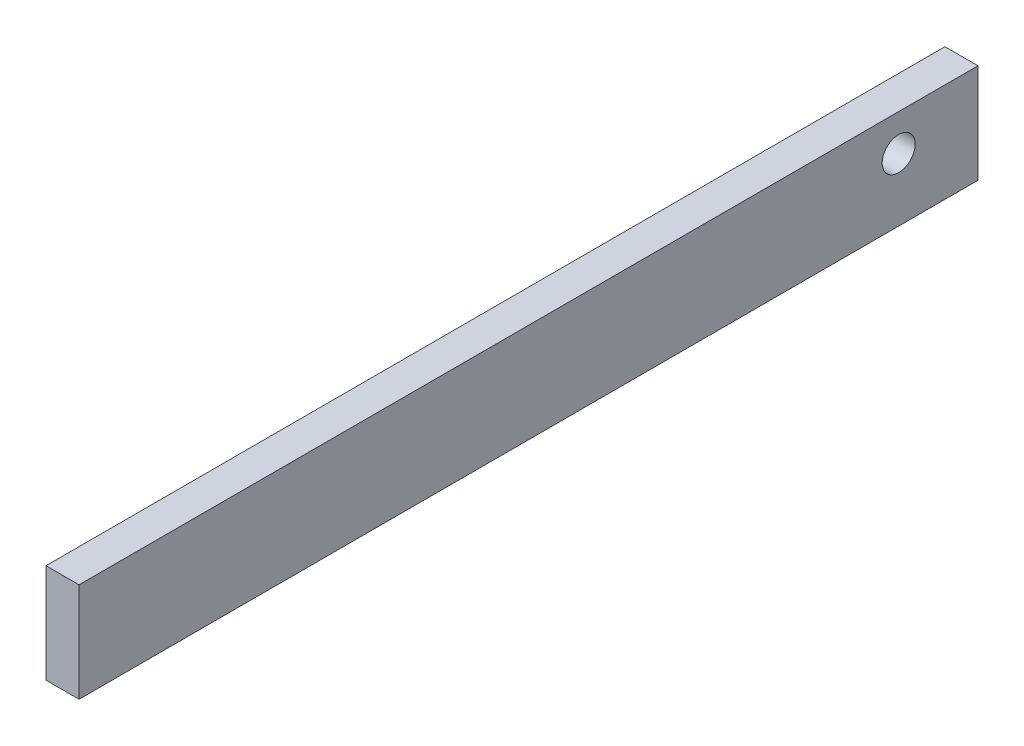
ISO-10303-21;
HEADER;
FILE_DESCRIPTION(('STEP AP214'),'2;1');
FILE_NAME('part.step','',(''),(''),'','','');
FILE_SCHEMA(('AUTOMOTIVE_DESIGN { 1 0 10303 214 1 1 1 1 }'));
ENDSEC;
DATA;
#1=APPLICATION_CONTEXT('core data for automotive mechanical design processes');
#2=APPLICATION_PROTOCOL_DEFINITION('international standard','automotive_design',2000,#1);
#3=PRODUCT_CONTEXT('',#1,'mechanical');
#4=PRODUCT('Part','Part','',(#3));
#5=PRODUCT_RELATED_PRODUCT_CATEGORY('part','',(#4));
#6=PRODUCT_DEFINITION_FORMATION('','',#4);
#7=PRODUCT_DEFINITION_CONTEXT('part definition',#1,'design');
#8=PRODUCT_DEFINITION('design','',#6,#7);
#9=PRODUCT_DEFINITION_SHAPE('','',#8);
#10=(LENGTH_UNIT() NAMED_UNIT(*) SI_UNIT(.MILLI.,.METRE.));
#11=(NAMED_UNIT(*) PLANE_ANGLE_UNIT() SI_UNIT($,.RADIAN.));
#12=(NAMED_UNIT(*) SI_UNIT($,.STERADIAN.) SOLID_ANGLE_UNIT());
#13=UNCERTAINTY_MEASURE_WITH_UNIT(LENGTH_MEASURE(1.E-05),#10,'distance_accuracy_value','');
#14=(GEOMETRIC_REPRESENTATION_CONTEXT(3) GLOBAL_UNCERTAINTY_ASSIGNED_CONTEXT((#13)) GLOBAL_UNIT_ASSIGNED_CONTEXT((#10,
#11,#12)) REPRESENTATION_CONTEXT('',''));
#15=CARTESIAN_POINT('',(0.,0.,0.));
#16=DIRECTION('',(0.,0.,1.));
#17=DIRECTION('',(1.,0.,0.));
#18=AXIS2_PLACEMENT_3D('',#15,#16,#17);
#19=CARTESIAN_POINT('',(0.,0.,172.72));
#20=DIRECTION('',(1.,0.,0.));
#21=DIRECTION('',(0.,1.,0.));
#22=AXIS2_PLACEMENT_3D('',#19,#20,#21);
#23=PLANE('',#22);
#24=CARTESIAN_POINT('',(0.,12.065,15.24));
#25=DIRECTION('',(1.,0.,0.));
#26=DIRECTION('',(0.,0.,-1.));
#27=AXIS2_PLACEMENT_3D('',#24,#25,#26);
#28=CIRCLE('',#27,3.17500010159999);
#29=CARTESIAN_POINT('',(0.,12.065,12.0649998984));
#30=VERTEX_POINT('',#29);
#31=EDGE_CURVE('E133',#30,#30,#28,.T.);
#32=ORIENTED_EDGE('',*,*,#31,.F.);
#33=EDGE_LOOP('',(#32));
#34=FACE_BOUND('',#33,.T.);
#35=DIRECTION('',(0.,-1.,0.));
#36=VECTOR('',#35,1.);
#37=CARTESIAN_POINT('',(0.,0.,0.));
#38=LINE('',#37,#36);
#39=CARTESIAN_POINT('',(0.,19.05,0.));
#40=VERTEX_POINT('',#39);
#41=CARTESIAN_POINT('',(0.,0.,0.));
#42=VERTEX_POINT('',#41);
#43=EDGE_CURVE('E115',#40,#42,#38,.T.);
#44=ORIENTED_EDGE('',*,*,#43,.F.);
#45=DIRECTION('',(0.,0.,-1.));
#46=VECTOR('',#45,1.);
#47=CARTESIAN_POINT('',(0.,19.05,172.72));
#48=LINE('',#47,#46);
#49=CARTESIAN_POINT('',(0.,19.05,172.72));
#50=VERTEX_POINT('',#49);
#51=EDGE_CURVE('E11',#50,#40,#48,.T.);
#52=ORIENTED_EDGE('',*,*,#51,.F.);
#53=DIRECTION('',(0.,-1.,0.));
#54=VECTOR('',#53,1.);
#55=CARTESIAN_POINT('',(0.,0.,172.72));
#56=LINE('',#55,#54);
#57=CARTESIAN_POINT('',(0.,0.,172.72));
#58=VERTEX_POINT('',#57);
#59=EDGE_CURVE('E104',#50,#58,#56,.T.);
#60=ORIENTED_EDGE('',*,*,#59,.T.);
#61=DIRECTION('',(0.,0.,-1.));
#62=VECTOR('',#61,1.);
#63=CARTESIAN_POINT('',(0.,0.,172.72));
#64=LINE('',#63,#62);
#65=EDGE_CURVE('E63',#58,#42,#64,.T.);
#66=ORIENTED_EDGE('',*,*,#65,.T.);
#67=EDGE_LOOP('',(#44,#52,#60,#66));
#68=FACE_BOUND('',#67,.T.);
#69=ADVANCED_FACE('F45',(#34,#68),#23,.T.);
#70=CARTESIAN_POINT('',(0.,19.05,172.72));
#71=DIRECTION('',(0.,1.,0.));
#72=DIRECTION('',(0.,0.,1.));
#73=AXIS2_PLACEMENT_3D('',#70,#71,#72);
#74=PLANE('',#73);
#75=DIRECTION('',(1.,0.,0.));
#76=VECTOR('',#75,1.);
#77=CARTESIAN_POINT('',(0.,19.05,0.));
#78=LINE('',#77,#76);
#79=CARTESIAN_POINT('',(-6.35,19.05,0.));
#80=VERTEX_POINT('',#79);
#81=EDGE_CURVE('E93',#80,#40,#78,.T.);
#82=ORIENTED_EDGE('',*,*,#81,.F.);
#83=DIRECTION('',(0.,0.,-1.));
#84=VECTOR('',#83,1.);
#85=CARTESIAN_POINT('',(-6.35,19.05,172.72));
#86=LINE('',#85,#84);
#87=CARTESIAN_POINT('',(-6.35,19.05,172.72));
#88=VERTEX_POINT('',#87);
#89=EDGE_CURVE('E55',#88,#80,#86,.T.);
#90=ORIENTED_EDGE('',*,*,#89,.F.);
#91=DIRECTION('',(1.,0.,0.));
#92=VECTOR('',#91,1.);
#93=CARTESIAN_POINT('',(0.,19.05,172.72));
#94=LINE('',#93,#92);
#95=EDGE_CURVE('E91',#88,#50,#94,.T.);
#96=ORIENTED_EDGE('',*,*,#95,.T.);
#97=ORIENTED_EDGE('',*,*,#51,.T.);
#98=EDGE_LOOP('',(#82,#90,#96,#97));
#99=FACE_BOUND('',#98,.T.);
#100=ADVANCED_FACE('F90',(#99),#74,.T.);
#101=CARTESIAN_POINT('',(-6.35,0.,172.72));
#102=DIRECTION('',(-1.,0.,0.));
#103=DIRECTION('',(0.,0.,1.));
#104=AXIS2_PLACEMENT_3D('',#101,#102,#103);
#105=PLANE('',#104);
#106=CARTESIAN_POINT('',(-6.35,12.065,15.24));
#107=DIRECTION('',(-1.,0.,0.));
#108=DIRECTION('',(0.,0.,1.));
#109=AXIS2_PLACEMENT_3D('',#106,#107,#108);
#110=CIRCLE('',#109,3.17500010159999);
#111=CARTESIAN_POINT('',(-6.35,12.065,18.4150001016));
#112=VERTEX_POINT('',#111);
#113=EDGE_CURVE('E48',#112,#112,#110,.T.);
#114=ORIENTED_EDGE('',*,*,#113,.F.);
#115=EDGE_LOOP('',(#114));
#116=FACE_BOUND('',#115,.T.);
#117=DIRECTION('',(0.,1.,0.));
#118=VECTOR('',#117,1.);
#119=CARTESIAN_POINT('',(-6.35,0.,0.));
#120=LINE('',#119,#118);
#121=CARTESIAN_POINT('',(-6.35,0.,0.));
#122=VERTEX_POINT('',#121);
#123=EDGE_CURVE('E120',#122,#80,#120,.T.);
#124=ORIENTED_EDGE('',*,*,#123,.F.);
#125=DIRECTION('',(0.,0.,-1.));
#126=VECTOR('',#125,1.);
#127=CARTESIAN_POINT('',(-6.35,0.,172.72));
#128=LINE('',#127,#126);
#129=CARTESIAN_POINT('',(-6.35,0.,172.72));
#130=VERTEX_POINT('',#129);
#131=EDGE_CURVE('E76',#130,#122,#128,.T.);
#132=ORIENTED_EDGE('',*,*,#131,.F.);
#133=DIRECTION('',(0.,1.,0.));
#134=VECTOR('',#133,1.);
#135=CARTESIAN_POINT('',(-6.35,0.,172.72));
#136=LINE('',#135,#134);
#137=EDGE_CURVE('E103',#130,#88,#136,.T.);
#138=ORIENTED_EDGE('',*,*,#137,.T.);
#139=ORIENTED_EDGE('',*,*,#89,.T.);
#140=EDGE_LOOP('',(#124,#132,#138,#139));
#141=FACE_BOUND('',#140,.T.);
#142=ADVANCED_FACE('F107',(#116,#141),#105,.T.);
#143=CARTESIAN_POINT('',(0.,0.,172.72));
#144=DIRECTION('',(0.,-1.,0.));
#145=DIRECTION('',(1.,0.,0.));
#146=AXIS2_PLACEMENT_3D('',#143,#144,#145);
#147=PLANE('',#146);
#148=DIRECTION('',(-1.,0.,0.));
#149=VECTOR('',#148,1.);
#150=CARTESIAN_POINT('',(0.,0.,0.));
#151=LINE('',#150,#149);
#152=EDGE_CURVE('E123',#42,#122,#151,.T.);
#153=ORIENTED_EDGE('',*,*,#152,.F.);
#154=ORIENTED_EDGE('',*,*,#65,.F.);
#155=DIRECTION('',(-1.,0.,0.));
#156=VECTOR('',#155,1.);
#157=CARTESIAN_POINT('',(0.,0.,172.72));
#158=LINE('',#157,#156);
#159=EDGE_CURVE('E109',#58,#130,#158,.T.);
#160=ORIENTED_EDGE('',*,*,#159,.T.);
#161=ORIENTED_EDGE('',*,*,#131,.T.);
#162=EDGE_LOOP('',(#153,#154,#160,#161));
#163=FACE_BOUND('',#162,.T.);
#164=ADVANCED_FACE('F145',(#163),#147,.T.);
#165=CARTESIAN_POINT('',(0.,0.,172.72));
#166=DIRECTION('',(0.,0.,1.));
#167=DIRECTION('',(1.,0.,0.));
#168=AXIS2_PLACEMENT_3D('',#165,#166,#167);
#169=PLANE('',#168);
#170=ORIENTED_EDGE('',*,*,#59,.F.);
#171=ORIENTED_EDGE('',*,*,#95,.F.);
#172=ORIENTED_EDGE('',*,*,#137,.F.);
#173=ORIENTED_EDGE('',*,*,#159,.F.);
#174=EDGE_LOOP('',(#170,#171,#172,#173));
#175=FACE_BOUND('',#174,.T.);
#176=ADVANCED_FACE('F101',(#175),#169,.T.);
#177=CARTESIAN_POINT('',(0.,0.,0.));
#178=DIRECTION('',(0.,0.,1.));
#179=DIRECTION('',(1.,0.,0.));
#180=AXIS2_PLACEMENT_3D('',#177,#178,#179);
#181=PLANE('',#180);
#182=ORIENTED_EDGE('',*,*,#43,.T.);
#183=ORIENTED_EDGE('',*,*,#152,.T.);
#184=ORIENTED_EDGE('',*,*,#123,.T.);
#185=ORIENTED_EDGE('',*,*,#81,.T.);
#186=EDGE_LOOP('',(#182,#183,#184,#185));
#187=FACE_BOUND('',#186,.T.);
#188=ADVANCED_FACE('F156',(#187),#181,.F.);
#189=CARTESIAN_POINT('',(-25.4,12.065,15.24));
#190=DIRECTION('',(1.,0.,0.));
#191=DIRECTION('',(0.,0.,-1.));
#192=AXIS2_PLACEMENT_3D('',#189,#190,#191);
#193=CYLINDRICAL_SURFACE('',#192,3.17500010159999);
#194=ORIENTED_EDGE('',*,*,#113,.T.);
#195=EDGE_LOOP('',(#194));
#196=FACE_BOUND('',#195,.T.);
#197=ORIENTED_EDGE('',*,*,#31,.T.);
#198=EDGE_LOOP('',(#197));
#199=FACE_BOUND('',#198,.T.);
#200=ADVANCED_FACE('F142',(#196,#199),#193,.F.);
#201=CLOSED_SHELL('',(#69,#100,#142,#164,#176,#188,#200));
#202=MANIFOLD_SOLID_BREP('B2',#201);
#203=ADVANCED_BREP_SHAPE_REPRESENTATION('',(#18,#202),#14);
#204=SHAPE_DEFINITION_REPRESENTATION(#9,#203);
ENDSEC;
END-ISO-10303-21;
